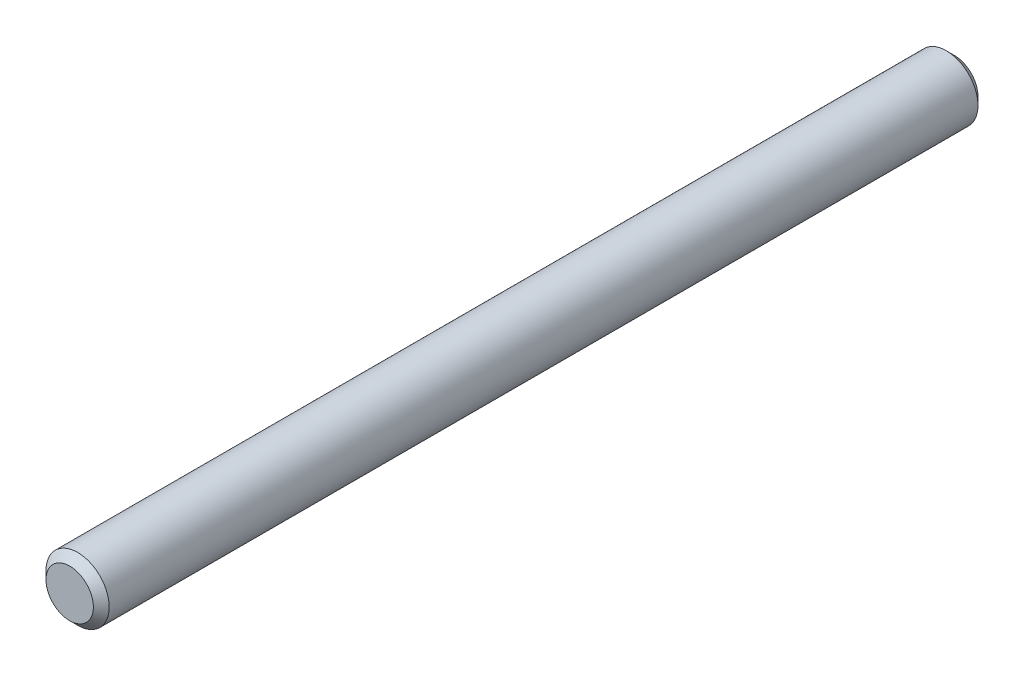
ISO-10303-21;
HEADER;
FILE_DESCRIPTION(('STEP AP214'),'2;1');
FILE_NAME('part.step','',(''),(''),'','','');
FILE_SCHEMA(('AUTOMOTIVE_DESIGN { 1 0 10303 214 1 1 1 1 }'));
ENDSEC;
DATA;
#1=APPLICATION_CONTEXT('core data for automotive mechanical design processes');
#2=APPLICATION_PROTOCOL_DEFINITION('international standard','automotive_design',2000,#1);
#3=PRODUCT_CONTEXT('',#1,'mechanical');
#4=PRODUCT('Part','Part','',(#3));
#5=PRODUCT_RELATED_PRODUCT_CATEGORY('part','',(#4));
#6=PRODUCT_DEFINITION_FORMATION('','',#4);
#7=PRODUCT_DEFINITION_CONTEXT('part definition',#1,'design');
#8=PRODUCT_DEFINITION('design','',#6,#7);
#9=PRODUCT_DEFINITION_SHAPE('','',#8);
#10=(LENGTH_UNIT() NAMED_UNIT(*) SI_UNIT(.MILLI.,.METRE.));
#11=(NAMED_UNIT(*) PLANE_ANGLE_UNIT() SI_UNIT($,.RADIAN.));
#12=(NAMED_UNIT(*) SI_UNIT($,.STERADIAN.) SOLID_ANGLE_UNIT());
#13=UNCERTAINTY_MEASURE_WITH_UNIT(LENGTH_MEASURE(1.E-05),#10,'distance_accuracy_value','');
#14=(GEOMETRIC_REPRESENTATION_CONTEXT(3) GLOBAL_UNCERTAINTY_ASSIGNED_CONTEXT((#13)) GLOBAL_UNIT_ASSIGNED_CONTEXT((#10,
#11,#12)) REPRESENTATION_CONTEXT('',''));
#15=CARTESIAN_POINT('',(0.,0.,0.));
#16=DIRECTION('',(0.,0.,1.));
#17=DIRECTION('',(1.,0.,0.));
#18=AXIS2_PLACEMENT_3D('',#15,#16,#17);
#19=CARTESIAN_POINT('',(0.,0.,-14.));
#20=DIRECTION('',(0.,0.,1.));
#21=DIRECTION('',(1.,0.,0.));
#22=AXIS2_PLACEMENT_3D('',#19,#20,#21);
#23=CONICAL_SURFACE('',#22,0.75,0.785398163397448);
#24=CARTESIAN_POINT('',(0.,0.,-13.75));
#25=DIRECTION('',(0.,0.,-1.));
#26=DIRECTION('',(-1.,0.,0.));
#27=AXIS2_PLACEMENT_3D('',#24,#25,#26);
#28=CIRCLE('',#27,1.);
#29=CARTESIAN_POINT('',(-0.999999999999996,0.,-13.75));
#30=VERTEX_POINT('',#29);
#31=EDGE_CURVE('E10',#30,#30,#28,.T.);
#32=ORIENTED_EDGE('',*,*,#31,.T.);
#33=EDGE_LOOP('',(#32));
#34=FACE_BOUND('',#33,.T.);
#35=CARTESIAN_POINT('',(0.,0.,-14.));
#36=DIRECTION('',(0.,0.,-1.));
#37=DIRECTION('',(-1.,0.,0.));
#38=AXIS2_PLACEMENT_3D('',#35,#36,#37);
#39=CIRCLE('',#38,0.75);
#40=CARTESIAN_POINT('',(-0.749999999999996,0.,-14.));
#41=VERTEX_POINT('',#40);
#42=EDGE_CURVE('E44',#41,#41,#39,.T.);
#43=ORIENTED_EDGE('',*,*,#42,.F.);
#44=EDGE_LOOP('',(#43));
#45=FACE_BOUND('',#44,.T.);
#46=ADVANCED_FACE('F30',(#34,#45),#23,.T.);
#47=CARTESIAN_POINT('',(0.,0.,14.));
#48=DIRECTION('',(0.,0.,-1.));
#49=DIRECTION('',(-1.,0.,0.));
#50=AXIS2_PLACEMENT_3D('',#47,#48,#49);
#51=CYLINDRICAL_SURFACE('',#50,1.);
#52=CARTESIAN_POINT('',(0.,0.,13.75));
#53=DIRECTION('',(0.,0.,-1.));
#54=DIRECTION('',(-1.,0.,0.));
#55=AXIS2_PLACEMENT_3D('',#52,#53,#54);
#56=CIRCLE('',#55,1.);
#57=CARTESIAN_POINT('',(-0.999999999999996,0.,13.75));
#58=VERTEX_POINT('',#57);
#59=EDGE_CURVE('E36',#58,#58,#56,.T.);
#60=ORIENTED_EDGE('',*,*,#59,.T.);
#61=EDGE_LOOP('',(#60));
#62=FACE_BOUND('',#61,.T.);
#63=ORIENTED_EDGE('',*,*,#31,.F.);
#64=EDGE_LOOP('',(#63));
#65=FACE_BOUND('',#64,.T.);
#66=ADVANCED_FACE('F53',(#62,#65),#51,.T.);
#67=CARTESIAN_POINT('',(0.,0.,13.75));
#68=DIRECTION('',(0.,0.,-1.));
#69=DIRECTION('',(-1.,0.,0.));
#70=AXIS2_PLACEMENT_3D('',#67,#68,#69);
#71=CONICAL_SURFACE('',#70,1.,0.785398163397448);
#72=CARTESIAN_POINT('',(0.,0.,14.));
#73=DIRECTION('',(0.,0.,-1.));
#74=DIRECTION('',(-1.,0.,0.));
#75=AXIS2_PLACEMENT_3D('',#72,#73,#74);
#76=CIRCLE('',#75,0.75);
#77=CARTESIAN_POINT('',(-0.749999999999996,0.,14.));
#78=VERTEX_POINT('',#77);
#79=EDGE_CURVE('E40',#78,#78,#76,.T.);
#80=ORIENTED_EDGE('',*,*,#79,.T.);
#81=EDGE_LOOP('',(#80));
#82=FACE_BOUND('',#81,.T.);
#83=ORIENTED_EDGE('',*,*,#59,.F.);
#84=EDGE_LOOP('',(#83));
#85=FACE_BOUND('',#84,.T.);
#86=ADVANCED_FACE('F57',(#82,#85),#71,.T.);
#87=CARTESIAN_POINT('',(0.750000000000004,0.,14.));
#88=DIRECTION('',(0.,0.,1.));
#89=DIRECTION('',(1.,0.,0.));
#90=AXIS2_PLACEMENT_3D('',#87,#88,#89);
#91=PLANE('',#90);
#92=ORIENTED_EDGE('',*,*,#79,.F.);
#93=EDGE_LOOP('',(#92));
#94=FACE_BOUND('',#93,.T.);
#95=ADVANCED_FACE('F61',(#94),#91,.T.);
#96=CARTESIAN_POINT('',(0.,0.,-14.));
#97=DIRECTION('',(0.,0.,-1.));
#98=DIRECTION('',(-1.,0.,0.));
#99=AXIS2_PLACEMENT_3D('',#96,#97,#98);
#100=PLANE('',#99);
#101=ORIENTED_EDGE('',*,*,#42,.T.);
#102=EDGE_LOOP('',(#101));
#103=FACE_BOUND('',#102,.T.);
#104=ADVANCED_FACE('F50',(#103),#100,.T.);
#105=CLOSED_SHELL('',(#46,#66,#86,#95,#104));
#106=MANIFOLD_SOLID_BREP('B2',#105);
#107=ADVANCED_BREP_SHAPE_REPRESENTATION('',(#18,#106),#14);
#108=SHAPE_DEFINITION_REPRESENTATION(#9,#107);
ENDSEC;
END-ISO-10303-21;
